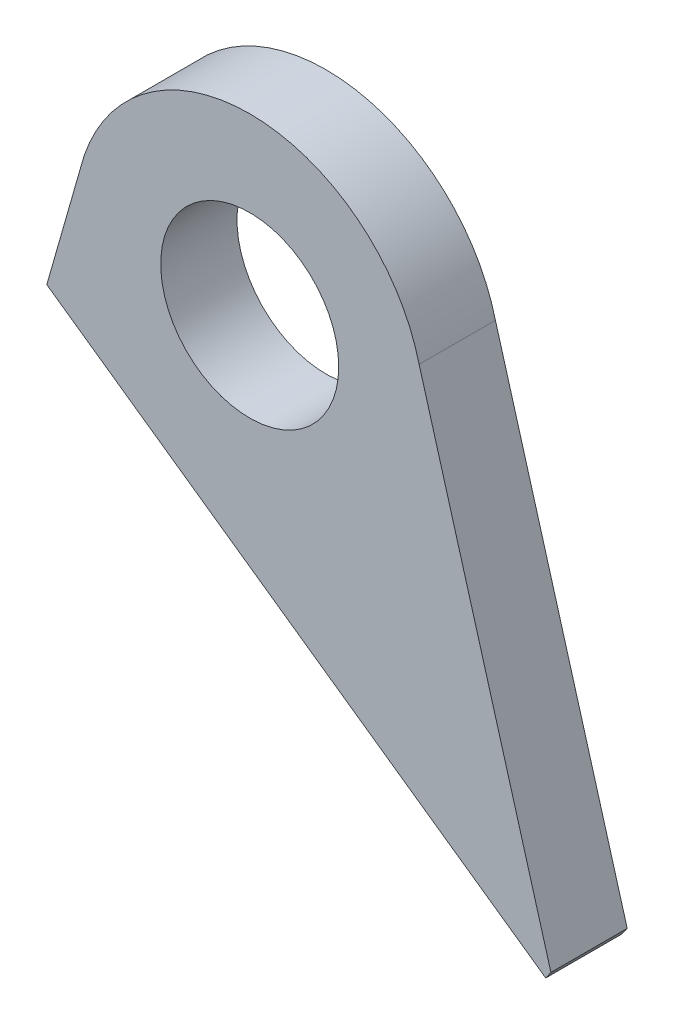
ISO-10303-21;
HEADER;
FILE_DESCRIPTION(('STEP AP214'),'2;1');
FILE_NAME('part.step','',(''),(''),'','','');
FILE_SCHEMA(('AUTOMOTIVE_DESIGN { 1 0 10303 214 1 1 1 1 }'));
ENDSEC;
DATA;
#1=APPLICATION_CONTEXT('core data for automotive mechanical design processes');
#2=APPLICATION_PROTOCOL_DEFINITION('international standard','automotive_design',2000,#1);
#3=PRODUCT_CONTEXT('',#1,'mechanical');
#4=PRODUCT('Part','Part','',(#3));
#5=PRODUCT_RELATED_PRODUCT_CATEGORY('part','',(#4));
#6=PRODUCT_DEFINITION_FORMATION('','',#4);
#7=PRODUCT_DEFINITION_CONTEXT('part definition',#1,'design');
#8=PRODUCT_DEFINITION('design','',#6,#7);
#9=PRODUCT_DEFINITION_SHAPE('','',#8);
#10=(LENGTH_UNIT() NAMED_UNIT(*) SI_UNIT(.MILLI.,.METRE.));
#11=(NAMED_UNIT(*) PLANE_ANGLE_UNIT() SI_UNIT($,.RADIAN.));
#12=(NAMED_UNIT(*) SI_UNIT($,.STERADIAN.) SOLID_ANGLE_UNIT());
#13=UNCERTAINTY_MEASURE_WITH_UNIT(LENGTH_MEASURE(1.E-05),#10,'distance_accuracy_value','');
#14=(GEOMETRIC_REPRESENTATION_CONTEXT(3) GLOBAL_UNCERTAINTY_ASSIGNED_CONTEXT((#13)) GLOBAL_UNIT_ASSIGNED_CONTEXT((#10,
#11,#12)) REPRESENTATION_CONTEXT('',''));
#15=CARTESIAN_POINT('',(0.,0.,0.));
#16=DIRECTION('',(0.,0.,1.));
#17=DIRECTION('',(1.,0.,0.));
#18=AXIS2_PLACEMENT_3D('',#15,#16,#17);
#19=CARTESIAN_POINT('',(60.,-60.,14.9999999999999));
#20=DIRECTION('',(-0.961435850271175,-0.275029281738042,0.));
#21=DIRECTION('',(0.275029281738042,-0.961435850271175,0.));
#22=AXIS2_PLACEMENT_3D('',#19,#20,#21);
#23=PLANE('',#22);
#24=DIRECTION('',(-0.275029281738042,0.961435850271175,0.));
#25=VECTOR('',#24,1.);
#26=CARTESIAN_POINT('',(60.,-60.,14.9999999999999));
#27=LINE('',#26,#25);
#28=CARTESIAN_POINT('',(59.2223999462373,-57.2816982826865,14.9999999999999));
#29=VERTEX_POINT('',#28);
#30=CARTESIAN_POINT('',(33.3081726656252,33.3081726656252,14.9999999999999));
#31=VERTEX_POINT('',#30);
#32=EDGE_CURVE('E109',#29,#31,#27,.T.);
#33=ORIENTED_EDGE('',*,*,#32,.F.);
#34=DIRECTION('',(0.,0.,-1.));
#35=VECTOR('',#34,1.);
#36=CARTESIAN_POINT('',(59.2223999462373,-57.2816982826865,14.9999999999999));
#37=LINE('',#36,#35);
#38=CARTESIAN_POINT('',(59.2223999462373,-57.2816982826865,0.));
#39=VERTEX_POINT('',#38);
#40=EDGE_CURVE('E90',#29,#39,#37,.T.);
#41=ORIENTED_EDGE('',*,*,#40,.T.);
#42=DIRECTION('',(-0.275029281738042,0.961435850271175,0.));
#43=VECTOR('',#42,1.);
#44=CARTESIAN_POINT('',(60.,-60.,0.));
#45=LINE('',#44,#43);
#46=CARTESIAN_POINT('',(33.3081726656253,33.3081726656251,0.));
#47=VERTEX_POINT('',#46);
#48=EDGE_CURVE('E89',#39,#47,#45,.T.);
#49=ORIENTED_EDGE('',*,*,#48,.T.);
#50=DIRECTION('',(0.,0.,-1.));
#51=VECTOR('',#50,1.);
#52=CARTESIAN_POINT('',(33.3081726656252,33.3081726656252,14.9999999999999));
#53=LINE('',#52,#51);
#54=EDGE_CURVE('E11',#31,#47,#53,.T.);
#55=ORIENTED_EDGE('',*,*,#54,.F.);
#56=EDGE_LOOP('',(#33,#41,#49,#55));
#57=FACE_BOUND('',#56,.T.);
#58=ADVANCED_FACE('F34',(#57),#23,.F.);
#59=CARTESIAN_POINT('',(0.,25.,14.9999999999999));
#60=DIRECTION('',(0.,0.,-1.));
#61=DIRECTION('',(-1.,0.,0.));
#62=AXIS2_PLACEMENT_3D('',#59,#60,#61);
#63=CYLINDRICAL_SURFACE('',#62,34.3287066369378);
#64=CARTESIAN_POINT('',(0.,25.,0.));
#65=DIRECTION('',(0.,0.,-1.));
#66=DIRECTION('',(-1.,0.,0.));
#67=AXIS2_PLACEMENT_3D('',#64,#65,#66);
#68=CIRCLE('',#67,34.3287066369378);
#69=CARTESIAN_POINT('',(-33.3081726656251,33.3081726656252,0.));
#70=VERTEX_POINT('',#69);
#71=EDGE_CURVE('E118',#70,#47,#68,.T.);
#72=ORIENTED_EDGE('',*,*,#71,.F.);
#73=DIRECTION('',(0.,0.,-1.));
#74=VECTOR('',#73,1.);
#75=CARTESIAN_POINT('',(-33.3081726656251,33.3081726656252,14.9999999999999));
#76=LINE('',#75,#74);
#77=CARTESIAN_POINT('',(-33.3081726656251,33.3081726656252,14.9999999999999));
#78=VERTEX_POINT('',#77);
#79=EDGE_CURVE('E41',#78,#70,#76,.T.);
#80=ORIENTED_EDGE('',*,*,#79,.F.);
#81=CARTESIAN_POINT('',(0.,25.,14.9999999999999));
#82=DIRECTION('',(0.,0.,-1.));
#83=DIRECTION('',(-1.,0.,0.));
#84=AXIS2_PLACEMENT_3D('',#81,#82,#83);
#85=CIRCLE('',#84,34.3287066369378);
#86=EDGE_CURVE('E111',#78,#31,#85,.T.);
#87=ORIENTED_EDGE('',*,*,#86,.T.);
#88=ORIENTED_EDGE('',*,*,#54,.T.);
#89=EDGE_LOOP('',(#72,#80,#87,#88));
#90=FACE_BOUND('',#89,.T.);
#91=ADVANCED_FACE('F128',(#90),#63,.T.);
#92=CARTESIAN_POINT('',(-59.9999999999999,-59.9999999999998,14.9999999999999));
#93=DIRECTION('',(-0.961435850271175,0.275029281738042,0.));
#94=DIRECTION('',(-0.275029281738042,-0.961435850271175,0.));
#95=AXIS2_PLACEMENT_3D('',#92,#93,#94);
#96=PLANE('',#95);
#97=DIRECTION('',(0.,0.,1.));
#98=VECTOR('',#97,1.);
#99=CARTESIAN_POINT('',(-39.8974320641131,10.2737154892558,0.));
#100=LINE('',#99,#98);
#101=CARTESIAN_POINT('',(-39.8974320641131,10.2737154892558,0.));
#102=VERTEX_POINT('',#101);
#103=CARTESIAN_POINT('',(-39.8974320641131,10.2737154892558,14.9999999999999));
#104=VERTEX_POINT('',#103);
#105=EDGE_CURVE('E94',#102,#104,#100,.T.);
#106=ORIENTED_EDGE('',*,*,#105,.T.);
#107=DIRECTION('',(0.275029281738042,0.961435850271175,0.));
#108=VECTOR('',#107,1.);
#109=CARTESIAN_POINT('',(-59.9999999999999,-59.9999999999998,14.9999999999999));
#110=LINE('',#109,#108);
#111=EDGE_CURVE('E115',#104,#78,#110,.T.);
#112=ORIENTED_EDGE('',*,*,#111,.T.);
#113=ORIENTED_EDGE('',*,*,#79,.T.);
#114=DIRECTION('',(0.275029281738042,0.961435850271175,0.));
#115=VECTOR('',#114,1.);
#116=CARTESIAN_POINT('',(-60.0000000000001,-59.9999999999999,0.));
#117=LINE('',#116,#115);
#118=EDGE_CURVE('E112',#102,#70,#117,.T.);
#119=ORIENTED_EDGE('',*,*,#118,.F.);
#120=EDGE_LOOP('',(#106,#112,#113,#119));
#121=FACE_BOUND('',#120,.T.);
#122=ADVANCED_FACE('F124',(#121),#96,.T.);
#123=CARTESIAN_POINT('',(0.,25.,14.9999999999999));
#124=DIRECTION('',(0.,0.,-1.));
#125=DIRECTION('',(-1.,0.,0.));
#126=AXIS2_PLACEMENT_3D('',#123,#124,#125);
#127=PLANE('',#126);
#128=CARTESIAN_POINT('',(0.,25.,14.9999999999999));
#129=DIRECTION('',(0.,0.,1.));
#130=DIRECTION('',(1.,0.,0.));
#131=AXIS2_PLACEMENT_3D('',#128,#129,#130);
#132=CIRCLE('',#131,17.5);
#133=CARTESIAN_POINT('',(17.4999999999999,25.,14.9999999999999));
#134=VERTEX_POINT('',#133);
#135=EDGE_CURVE('E98',#134,#134,#132,.T.);
#136=ORIENTED_EDGE('',*,*,#135,.F.);
#137=EDGE_LOOP('',(#136));
#138=FACE_BOUND('',#137,.T.);
#139=DIRECTION('',(-0.817900728192114,0.575359364938827,0.));
#140=VECTOR('',#139,1.);
#141=CARTESIAN_POINT('',(60.,-60.,14.9999999999999));
#142=LINE('',#141,#140);
#143=CARTESIAN_POINT('',(58.2006183979774,-58.7342093971346,14.9999999999999));
#144=VERTEX_POINT('',#143);
#145=EDGE_CURVE('E96',#144,#104,#142,.T.);
#146=ORIENTED_EDGE('',*,*,#145,.F.);
#147=DIRECTION('',(-0.575359364938827,-0.817900728192113,0.));
#148=VECTOR('',#147,1.);
#149=CARTESIAN_POINT('',(63.9542120473657,-50.5552021152134,14.9999999999999));
#150=LINE('',#149,#148);
#151=EDGE_CURVE('E48',#29,#144,#150,.T.);
#152=ORIENTED_EDGE('',*,*,#151,.F.);
#153=ORIENTED_EDGE('',*,*,#32,.T.);
#154=ORIENTED_EDGE('',*,*,#86,.F.);
#155=ORIENTED_EDGE('',*,*,#111,.F.);
#156=EDGE_LOOP('',(#146,#152,#153,#154,#155));
#157=FACE_BOUND('',#156,.T.);
#158=ADVANCED_FACE('F133',(#138,#157),#127,.F.);
#159=CARTESIAN_POINT('',(0.,25.,0.));
#160=DIRECTION('',(0.,0.,-1.));
#161=DIRECTION('',(-1.,0.,0.));
#162=AXIS2_PLACEMENT_3D('',#159,#160,#161);
#163=PLANE('',#162);
#164=DIRECTION('',(-0.575359364938827,-0.817900728192113,0.));
#165=VECTOR('',#164,1.);
#166=CARTESIAN_POINT('',(63.9542120473657,-50.5552021152134,0.));
#167=LINE('',#166,#165);
#168=CARTESIAN_POINT('',(58.2006183979774,-58.7342093971346,0.));
#169=VERTEX_POINT('',#168);
#170=EDGE_CURVE('E80',#39,#169,#167,.T.);
#171=ORIENTED_EDGE('',*,*,#170,.T.);
#172=DIRECTION('',(-0.817900728192114,0.575359364938827,0.));
#173=VECTOR('',#172,1.);
#174=CARTESIAN_POINT('',(60.,-60.,0.));
#175=LINE('',#174,#173);
#176=EDGE_CURVE('E56',#169,#102,#175,.T.);
#177=ORIENTED_EDGE('',*,*,#176,.T.);
#178=ORIENTED_EDGE('',*,*,#118,.T.);
#179=ORIENTED_EDGE('',*,*,#71,.T.);
#180=ORIENTED_EDGE('',*,*,#48,.F.);
#181=EDGE_LOOP('',(#171,#177,#178,#179,#180));
#182=FACE_BOUND('',#181,.T.);
#183=CARTESIAN_POINT('',(0.,25.,0.));
#184=DIRECTION('',(0.,0.,1.));
#185=DIRECTION('',(1.,0.,0.));
#186=AXIS2_PLACEMENT_3D('',#183,#184,#185);
#187=CIRCLE('',#186,17.5);
#188=CARTESIAN_POINT('',(17.5,25.,0.));
#189=VERTEX_POINT('',#188);
#190=EDGE_CURVE('E104',#189,#189,#187,.T.);
#191=ORIENTED_EDGE('',*,*,#190,.T.);
#192=EDGE_LOOP('',(#191));
#193=FACE_BOUND('',#192,.T.);
#194=ADVANCED_FACE('F86',(#182,#193),#163,.T.);
#195=CARTESIAN_POINT('',(0.,25.,0.));
#196=DIRECTION('',(0.,0.,1.));
#197=DIRECTION('',(1.,0.,0.));
#198=AXIS2_PLACEMENT_3D('',#195,#196,#197);
#199=CYLINDRICAL_SURFACE('',#198,17.5);
#200=ORIENTED_EDGE('',*,*,#190,.F.);
#201=EDGE_LOOP('',(#200));
#202=FACE_BOUND('',#201,.T.);
#203=ORIENTED_EDGE('',*,*,#135,.T.);
#204=EDGE_LOOP('',(#203));
#205=FACE_BOUND('',#204,.T.);
#206=ADVANCED_FACE('F141',(#202,#205),#199,.F.);
#207=CARTESIAN_POINT('',(60.,-60.,0.));
#208=DIRECTION('',(0.575359364938827,0.817900728192113,0.));
#209=DIRECTION('',(-0.817900728192114,0.575359364938827,0.));
#210=AXIS2_PLACEMENT_3D('',#207,#208,#209);
#211=PLANE('',#210);
#212=ORIENTED_EDGE('',*,*,#176,.F.);
#213=DIRECTION('',(0.,0.,-1.));
#214=VECTOR('',#213,1.);
#215=CARTESIAN_POINT('',(58.2006183979774,-58.7342093971346,14.9999999999999));
#216=LINE('',#215,#214);
#217=EDGE_CURVE('E78',#144,#169,#216,.T.);
#218=ORIENTED_EDGE('',*,*,#217,.F.);
#219=ORIENTED_EDGE('',*,*,#145,.T.);
#220=ORIENTED_EDGE('',*,*,#105,.F.);
#221=EDGE_LOOP('',(#212,#218,#219,#220));
#222=FACE_BOUND('',#221,.T.);
#223=ADVANCED_FACE('F92',(#222),#211,.F.);
#224=CARTESIAN_POINT('',(63.9542120473657,-50.5552021152134,14.9999999999999));
#225=DIRECTION('',(-0.817900728192113,0.575359364938827,0.));
#226=DIRECTION('',(-0.575359364938827,-0.817900728192113,0.));
#227=AXIS2_PLACEMENT_3D('',#224,#225,#226);
#228=PLANE('',#227);
#229=ORIENTED_EDGE('',*,*,#151,.T.);
#230=ORIENTED_EDGE('',*,*,#217,.T.);
#231=ORIENTED_EDGE('',*,*,#170,.F.);
#232=ORIENTED_EDGE('',*,*,#40,.F.);
#233=EDGE_LOOP('',(#229,#230,#231,#232));
#234=FACE_BOUND('',#233,.T.);
#235=ADVANCED_FACE('F79',(#234),#228,.F.);
#236=CLOSED_SHELL('',(#58,#91,#122,#158,#194,#206,#223,#235));
#237=MANIFOLD_SOLID_BREP('B2',#236);
#238=ADVANCED_BREP_SHAPE_REPRESENTATION('',(#18,#237),#14);
#239=SHAPE_DEFINITION_REPRESENTATION(#9,#238);
ENDSEC;
END-ISO-10303-21;
